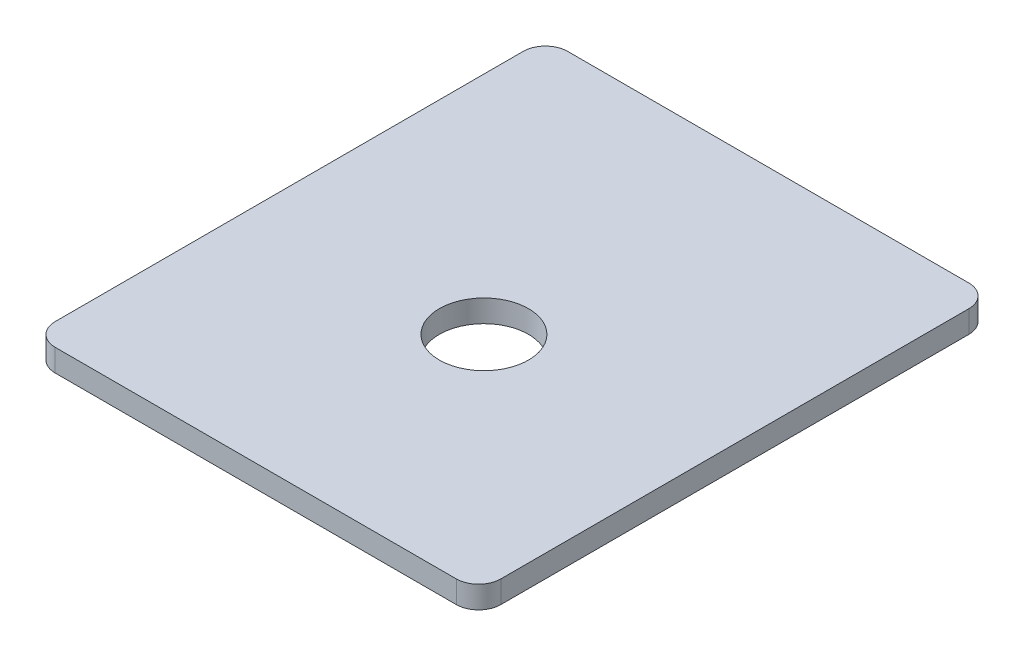
ISO-10303-21;
HEADER;
FILE_DESCRIPTION(('STEP AP214'),'2;1');
FILE_NAME('part.step','',(''),(''),'','','');
FILE_SCHEMA(('AUTOMOTIVE_DESIGN { 1 0 10303 214 1 1 1 1 }'));
ENDSEC;
DATA;
#1=APPLICATION_CONTEXT('core data for automotive mechanical design processes');
#2=APPLICATION_PROTOCOL_DEFINITION('international standard','automotive_design',2000,#1);
#3=PRODUCT_CONTEXT('',#1,'mechanical');
#4=PRODUCT('Part','Part','',(#3));
#5=PRODUCT_RELATED_PRODUCT_CATEGORY('part','',(#4));
#6=PRODUCT_DEFINITION_FORMATION('','',#4);
#7=PRODUCT_DEFINITION_CONTEXT('part definition',#1,'design');
#8=PRODUCT_DEFINITION('design','',#6,#7);
#9=PRODUCT_DEFINITION_SHAPE('','',#8);
#10=(LENGTH_UNIT() NAMED_UNIT(*) SI_UNIT(.MILLI.,.METRE.));
#11=(NAMED_UNIT(*) PLANE_ANGLE_UNIT() SI_UNIT($,.RADIAN.));
#12=(NAMED_UNIT(*) SI_UNIT($,.STERADIAN.) SOLID_ANGLE_UNIT());
#13=UNCERTAINTY_MEASURE_WITH_UNIT(LENGTH_MEASURE(1.E-05),#10,'distance_accuracy_value','');
#14=(GEOMETRIC_REPRESENTATION_CONTEXT(3) GLOBAL_UNCERTAINTY_ASSIGNED_CONTEXT((#13)) GLOBAL_UNIT_ASSIGNED_CONTEXT((#10,
#11,#12)) REPRESENTATION_CONTEXT('',''));
#15=CARTESIAN_POINT('',(0.,0.,0.));
#16=DIRECTION('',(0.,0.,1.));
#17=DIRECTION('',(1.,0.,0.));
#18=AXIS2_PLACEMENT_3D('',#15,#16,#17);
#19=CARTESIAN_POINT('',(-20.,2.,21.));
#20=DIRECTION('',(1.,0.,0.));
#21=DIRECTION('',(0.,0.,-1.));
#22=AXIS2_PLACEMENT_3D('',#19,#20,#21);
#23=PLANE('',#22);
#24=DIRECTION('',(0.,0.,-1.));
#25=VECTOR('',#24,1.);
#26=CARTESIAN_POINT('',(-20.,0.,21.));
#27=LINE('',#26,#25);
#28=CARTESIAN_POINT('',(-20.,0.,-19.));
#29=VERTEX_POINT('',#28);
#30=CARTESIAN_POINT('',(-20.,0.,23.));
#31=VERTEX_POINT('',#30);
#32=EDGE_CURVE('E116',#29,#31,#27,.F.);
#33=ORIENTED_EDGE('',*,*,#32,.T.);
#34=DIRECTION('',(0.,-1.,0.));
#35=VECTOR('',#34,1.);
#36=CARTESIAN_POINT('',(-20.,2.,23.));
#37=LINE('',#36,#35);
#38=CARTESIAN_POINT('',(-20.,2.,23.));
#39=VERTEX_POINT('',#38);
#40=EDGE_CURVE('E168',#31,#39,#37,.F.);
#41=ORIENTED_EDGE('',*,*,#40,.T.);
#42=DIRECTION('',(0.,0.,1.));
#43=VECTOR('',#42,1.);
#44=CARTESIAN_POINT('',(-20.,2.,21.));
#45=LINE('',#44,#43);
#46=CARTESIAN_POINT('',(-20.,2.,-19.));
#47=VERTEX_POINT('',#46);
#48=EDGE_CURVE('E140',#47,#39,#45,.T.);
#49=ORIENTED_EDGE('',*,*,#48,.F.);
#50=DIRECTION('',(0.,-1.,0.));
#51=VECTOR('',#50,1.);
#52=CARTESIAN_POINT('',(-20.,2.,-19.));
#53=LINE('',#52,#51);
#54=EDGE_CURVE('E149',#47,#29,#53,.T.);
#55=ORIENTED_EDGE('',*,*,#54,.T.);
#56=EDGE_LOOP('',(#33,#41,#49,#55));
#57=FACE_BOUND('',#56,.T.);
#58=ADVANCED_FACE('F43',(#57),#23,.F.);
#59=CARTESIAN_POINT('',(18.,2.,-19.));
#60=DIRECTION('',(0.,1.,0.));
#61=DIRECTION('',(0.,0.,1.));
#62=AXIS2_PLACEMENT_3D('',#59,#60,#61);
#63=PLANE('',#62);
#64=DIRECTION('',(-1.,0.,0.));
#65=VECTOR('',#64,1.);
#66=CARTESIAN_POINT('',(20.,2.,25.));
#67=LINE('',#66,#65);
#68=CARTESIAN_POINT('',(18.,2.,25.));
#69=VERTEX_POINT('',#68);
#70=CARTESIAN_POINT('',(-18.,2.,25.));
#71=VERTEX_POINT('',#70);
#72=EDGE_CURVE('E155',#69,#71,#67,.T.);
#73=ORIENTED_EDGE('',*,*,#72,.F.);
#74=CARTESIAN_POINT('',(18.,2.,23.));
#75=DIRECTION('',(0.,1.,0.));
#76=DIRECTION('',(0.,0.,1.));
#77=AXIS2_PLACEMENT_3D('',#74,#75,#76);
#78=CIRCLE('',#77,2.);
#79=CARTESIAN_POINT('',(20.,2.,23.));
#80=VERTEX_POINT('',#79);
#81=EDGE_CURVE('E11',#69,#80,#78,.T.);
#82=ORIENTED_EDGE('',*,*,#81,.T.);
#83=DIRECTION('',(0.,0.,-1.));
#84=VECTOR('',#83,1.);
#85=CARTESIAN_POINT('',(20.,2.,27.));
#86=LINE('',#85,#84);
#87=CARTESIAN_POINT('',(20.,2.,-19.));
#88=VERTEX_POINT('',#87);
#89=EDGE_CURVE('E102',#80,#88,#86,.T.);
#90=ORIENTED_EDGE('',*,*,#89,.T.);
#91=CARTESIAN_POINT('',(18.,2.,-19.));
#92=DIRECTION('',(0.,1.,0.));
#93=DIRECTION('',(0.,0.,1.));
#94=AXIS2_PLACEMENT_3D('',#91,#92,#93);
#95=CIRCLE('',#94,2.);
#96=CARTESIAN_POINT('',(18.,2.,-21.));
#97=VERTEX_POINT('',#96);
#98=EDGE_CURVE('E109',#88,#97,#95,.T.);
#99=ORIENTED_EDGE('',*,*,#98,.T.);
#100=DIRECTION('',(-1.,0.,0.));
#101=VECTOR('',#100,1.);
#102=CARTESIAN_POINT('',(18.,2.,-21.));
#103=LINE('',#102,#101);
#104=CARTESIAN_POINT('',(-18.,2.,-21.));
#105=VERTEX_POINT('',#104);
#106=EDGE_CURVE('E128',#97,#105,#103,.T.);
#107=ORIENTED_EDGE('',*,*,#106,.T.);
#108=CARTESIAN_POINT('',(-18.,2.,-19.));
#109=DIRECTION('',(0.,1.,0.));
#110=DIRECTION('',(0.,0.,1.));
#111=AXIS2_PLACEMENT_3D('',#108,#109,#110);
#112=CIRCLE('',#111,2.);
#113=EDGE_CURVE('E135',#105,#47,#112,.T.);
#114=ORIENTED_EDGE('',*,*,#113,.T.);
#115=ORIENTED_EDGE('',*,*,#48,.T.);
#116=CARTESIAN_POINT('',(-18.,2.,23.));
#117=DIRECTION('',(0.,1.,0.));
#118=DIRECTION('',(0.,0.,1.));
#119=AXIS2_PLACEMENT_3D('',#116,#117,#118);
#120=CIRCLE('',#119,2.);
#121=EDGE_CURVE('E166',#39,#71,#120,.T.);
#122=ORIENTED_EDGE('',*,*,#121,.T.);
#123=EDGE_LOOP('',(#73,#82,#90,#99,#107,#114,#115,#122));
#124=FACE_BOUND('',#123,.T.);
#125=CARTESIAN_POINT('',(0.232716016147772,2.,4.75187196741028));
#126=DIRECTION('',(0.,1.,0.));
#127=DIRECTION('',(0.,0.,1.));
#128=AXIS2_PLACEMENT_3D('',#125,#126,#127);
#129=CIRCLE('',#128,4.);
#130=CARTESIAN_POINT('',(0.232716016147772,2.,8.75187196741028));
#131=VERTEX_POINT('',#130);
#132=EDGE_CURVE('E139',#131,#131,#129,.T.);
#133=ORIENTED_EDGE('',*,*,#132,.F.);
#134=EDGE_LOOP('',(#133));
#135=FACE_BOUND('',#134,.T.);
#136=ADVANCED_FACE('F110',(#124,#135),#63,.T.);
#137=CARTESIAN_POINT('',(18.,0.,-19.));
#138=DIRECTION('',(0.,1.,0.));
#139=DIRECTION('',(0.,0.,1.));
#140=AXIS2_PLACEMENT_3D('',#137,#138,#139);
#141=PLANE('',#140);
#142=DIRECTION('',(0.,0.,-1.));
#143=VECTOR('',#142,1.);
#144=CARTESIAN_POINT('',(20.,0.,21.));
#145=LINE('',#144,#143);
#146=CARTESIAN_POINT('',(20.,0.,23.));
#147=VERTEX_POINT('',#146);
#148=CARTESIAN_POINT('',(20.,0.,-19.));
#149=VERTEX_POINT('',#148);
#150=EDGE_CURVE('E122',#147,#149,#145,.T.);
#151=ORIENTED_EDGE('',*,*,#150,.F.);
#152=CARTESIAN_POINT('',(18.,0.,23.));
#153=DIRECTION('',(0.,1.,0.));
#154=DIRECTION('',(0.,0.,1.));
#155=AXIS2_PLACEMENT_3D('',#152,#153,#154);
#156=CIRCLE('',#155,2.);
#157=CARTESIAN_POINT('',(18.,0.,25.));
#158=VERTEX_POINT('',#157);
#159=EDGE_CURVE('E63',#147,#158,#156,.F.);
#160=ORIENTED_EDGE('',*,*,#159,.T.);
#161=DIRECTION('',(-1.,0.,0.));
#162=VECTOR('',#161,1.);
#163=CARTESIAN_POINT('',(32.,0.,25.));
#164=LINE('',#163,#162);
#165=CARTESIAN_POINT('',(-18.,0.,25.));
#166=VERTEX_POINT('',#165);
#167=EDGE_CURVE('E153',#158,#166,#164,.T.);
#168=ORIENTED_EDGE('',*,*,#167,.T.);
#169=CARTESIAN_POINT('',(-18.,0.,23.));
#170=DIRECTION('',(0.,1.,0.));
#171=DIRECTION('',(0.,0.,1.));
#172=AXIS2_PLACEMENT_3D('',#169,#170,#171);
#173=CIRCLE('',#172,2.);
#174=EDGE_CURVE('E165',#166,#31,#173,.F.);
#175=ORIENTED_EDGE('',*,*,#174,.T.);
#176=ORIENTED_EDGE('',*,*,#32,.F.);
#177=CARTESIAN_POINT('',(-18.,0.,-19.));
#178=DIRECTION('',(0.,1.,0.));
#179=DIRECTION('',(0.,0.,1.));
#180=AXIS2_PLACEMENT_3D('',#177,#178,#179);
#181=CIRCLE('',#180,2.);
#182=CARTESIAN_POINT('',(-18.,0.,-21.));
#183=VERTEX_POINT('',#182);
#184=EDGE_CURVE('E144',#183,#29,#181,.T.);
#185=ORIENTED_EDGE('',*,*,#184,.F.);
#186=DIRECTION('',(-1.,0.,0.));
#187=VECTOR('',#186,1.);
#188=CARTESIAN_POINT('',(18.,0.,-21.));
#189=LINE('',#188,#187);
#190=CARTESIAN_POINT('',(18.,0.,-21.));
#191=VERTEX_POINT('',#190);
#192=EDGE_CURVE('E145',#191,#183,#189,.T.);
#193=ORIENTED_EDGE('',*,*,#192,.F.);
#194=CARTESIAN_POINT('',(18.,0.,-19.));
#195=DIRECTION('',(0.,1.,0.));
#196=DIRECTION('',(0.,0.,1.));
#197=AXIS2_PLACEMENT_3D('',#194,#195,#196);
#198=CIRCLE('',#197,2.);
#199=EDGE_CURVE('E137',#149,#191,#198,.T.);
#200=ORIENTED_EDGE('',*,*,#199,.F.);
#201=EDGE_LOOP('',(#151,#160,#168,#175,#176,#185,#193,#200));
#202=FACE_BOUND('',#201,.T.);
#203=CARTESIAN_POINT('',(0.232716016147772,0.,4.75187196741028));
#204=DIRECTION('',(0.,1.,0.));
#205=DIRECTION('',(0.,0.,1.));
#206=AXIS2_PLACEMENT_3D('',#203,#204,#205);
#207=CIRCLE('',#206,4.);
#208=CARTESIAN_POINT('',(0.232716016147772,0.,8.75187196741028));
#209=VERTEX_POINT('',#208);
#210=EDGE_CURVE('E151',#209,#209,#207,.T.);
#211=ORIENTED_EDGE('',*,*,#210,.T.);
#212=EDGE_LOOP('',(#211));
#213=FACE_BOUND('',#212,.T.);
#214=ADVANCED_FACE('F172',(#202,#213),#141,.F.);
#215=CARTESIAN_POINT('',(20.,2.,21.));
#216=DIRECTION('',(-1.,0.,0.));
#217=DIRECTION('',(0.,0.,1.));
#218=AXIS2_PLACEMENT_3D('',#215,#216,#217);
#219=PLANE('',#218);
#220=ORIENTED_EDGE('',*,*,#89,.F.);
#221=DIRECTION('',(0.,-1.,0.));
#222=VECTOR('',#221,1.);
#223=CARTESIAN_POINT('',(20.,2.,23.));
#224=LINE('',#223,#222);
#225=EDGE_CURVE('E171',#80,#147,#224,.T.);
#226=ORIENTED_EDGE('',*,*,#225,.T.);
#227=ORIENTED_EDGE('',*,*,#150,.T.);
#228=DIRECTION('',(0.,-1.,0.));
#229=VECTOR('',#228,1.);
#230=CARTESIAN_POINT('',(20.,2.,-19.));
#231=LINE('',#230,#229);
#232=EDGE_CURVE('E118',#88,#149,#231,.T.);
#233=ORIENTED_EDGE('',*,*,#232,.F.);
#234=EDGE_LOOP('',(#220,#226,#227,#233));
#235=FACE_BOUND('',#234,.T.);
#236=ADVANCED_FACE('F119',(#235),#219,.F.);
#237=CARTESIAN_POINT('',(18.,2.,-19.));
#238=DIRECTION('',(0.,-1.,0.));
#239=DIRECTION('',(0.,0.,-1.));
#240=AXIS2_PLACEMENT_3D('',#237,#238,#239);
#241=CYLINDRICAL_SURFACE('',#240,2.);
#242=ORIENTED_EDGE('',*,*,#199,.T.);
#243=DIRECTION('',(0.,-1.,0.));
#244=VECTOR('',#243,1.);
#245=CARTESIAN_POINT('',(18.,2.,-21.));
#246=LINE('',#245,#244);
#247=EDGE_CURVE('E123',#97,#191,#246,.T.);
#248=ORIENTED_EDGE('',*,*,#247,.F.);
#249=ORIENTED_EDGE('',*,*,#98,.F.);
#250=ORIENTED_EDGE('',*,*,#232,.T.);
#251=EDGE_LOOP('',(#242,#248,#249,#250));
#252=FACE_BOUND('',#251,.T.);
#253=ADVANCED_FACE('F130',(#252),#241,.T.);
#254=CARTESIAN_POINT('',(18.,2.,-21.));
#255=DIRECTION('',(0.,0.,1.));
#256=DIRECTION('',(1.,0.,0.));
#257=AXIS2_PLACEMENT_3D('',#254,#255,#256);
#258=PLANE('',#257);
#259=ORIENTED_EDGE('',*,*,#192,.T.);
#260=DIRECTION('',(0.,-1.,0.));
#261=VECTOR('',#260,1.);
#262=CARTESIAN_POINT('',(-18.,2.,-21.));
#263=LINE('',#262,#261);
#264=EDGE_CURVE('E143',#105,#183,#263,.T.);
#265=ORIENTED_EDGE('',*,*,#264,.F.);
#266=ORIENTED_EDGE('',*,*,#106,.F.);
#267=ORIENTED_EDGE('',*,*,#247,.T.);
#268=EDGE_LOOP('',(#259,#265,#266,#267));
#269=FACE_BOUND('',#268,.T.);
#270=ADVANCED_FACE('F177',(#269),#258,.F.);
#271=CARTESIAN_POINT('',(-18.,2.,-19.));
#272=DIRECTION('',(0.,-1.,0.));
#273=DIRECTION('',(0.,0.,-1.));
#274=AXIS2_PLACEMENT_3D('',#271,#272,#273);
#275=CYLINDRICAL_SURFACE('',#274,2.);
#276=ORIENTED_EDGE('',*,*,#184,.T.);
#277=ORIENTED_EDGE('',*,*,#54,.F.);
#278=ORIENTED_EDGE('',*,*,#113,.F.);
#279=ORIENTED_EDGE('',*,*,#264,.T.);
#280=EDGE_LOOP('',(#276,#277,#278,#279));
#281=FACE_BOUND('',#280,.T.);
#282=ADVANCED_FACE('F187',(#281),#275,.T.);
#283=CARTESIAN_POINT('',(0.232716016147772,2.,4.75187196741028));
#284=DIRECTION('',(0.,-1.,0.));
#285=DIRECTION('',(0.,0.,-1.));
#286=AXIS2_PLACEMENT_3D('',#283,#284,#285);
#287=CYLINDRICAL_SURFACE('',#286,4.);
#288=ORIENTED_EDGE('',*,*,#132,.T.);
#289=EDGE_LOOP('',(#288));
#290=FACE_BOUND('',#289,.T.);
#291=ORIENTED_EDGE('',*,*,#210,.F.);
#292=EDGE_LOOP('',(#291));
#293=FACE_BOUND('',#292,.T.);
#294=ADVANCED_FACE('F209',(#290,#293),#287,.F.);
#295=CARTESIAN_POINT('',(32.,42.,25.));
#296=DIRECTION('',(0.,0.,-1.));
#297=DIRECTION('',(-1.,0.,0.));
#298=AXIS2_PLACEMENT_3D('',#295,#296,#297);
#299=PLANE('',#298);
#300=ORIENTED_EDGE('',*,*,#167,.F.);
#301=DIRECTION('',(0.,-1.,0.));
#302=VECTOR('',#301,1.);
#303=CARTESIAN_POINT('',(18.,42.,25.));
#304=LINE('',#303,#302);
#305=EDGE_CURVE('E51',#158,#69,#304,.F.);
#306=ORIENTED_EDGE('',*,*,#305,.T.);
#307=ORIENTED_EDGE('',*,*,#72,.T.);
#308=DIRECTION('',(0.,-1.,0.));
#309=VECTOR('',#308,1.);
#310=CARTESIAN_POINT('',(-18.,42.,25.));
#311=LINE('',#310,#309);
#312=EDGE_CURVE('E121',#71,#166,#311,.T.);
#313=ORIENTED_EDGE('',*,*,#312,.T.);
#314=EDGE_LOOP('',(#300,#306,#307,#313));
#315=FACE_BOUND('',#314,.T.);
#316=ADVANCED_FACE('F199',(#315),#299,.F.);
#317=CARTESIAN_POINT('',(-18.,42.,23.));
#318=DIRECTION('',(0.,-1.,0.));
#319=DIRECTION('',(0.,0.,-1.));
#320=AXIS2_PLACEMENT_3D('',#317,#318,#319);
#321=CYLINDRICAL_SURFACE('',#320,2.);
#322=ORIENTED_EDGE('',*,*,#121,.F.);
#323=ORIENTED_EDGE('',*,*,#40,.F.);
#324=ORIENTED_EDGE('',*,*,#174,.F.);
#325=ORIENTED_EDGE('',*,*,#312,.F.);
#326=EDGE_LOOP('',(#322,#323,#324,#325));
#327=FACE_BOUND('',#326,.T.);
#328=ADVANCED_FACE('F192',(#327),#321,.T.);
#329=CARTESIAN_POINT('',(18.,2.,23.));
#330=DIRECTION('',(0.,-1.,0.));
#331=DIRECTION('',(0.,0.,-1.));
#332=AXIS2_PLACEMENT_3D('',#329,#330,#331);
#333=CYLINDRICAL_SURFACE('',#332,2.);
#334=ORIENTED_EDGE('',*,*,#81,.F.);
#335=ORIENTED_EDGE('',*,*,#305,.F.);
#336=ORIENTED_EDGE('',*,*,#159,.F.);
#337=ORIENTED_EDGE('',*,*,#225,.F.);
#338=EDGE_LOOP('',(#334,#335,#336,#337));
#339=FACE_BOUND('',#338,.T.);
#340=ADVANCED_FACE('F44',(#339),#333,.T.);
#341=CLOSED_SHELL('',(#58,#136,#214,#236,#253,#270,#282,#294,#316,#328,#340));
#342=MANIFOLD_SOLID_BREP('B2',#341);
#343=ADVANCED_BREP_SHAPE_REPRESENTATION('',(#18,#342),#14);
#344=SHAPE_DEFINITION_REPRESENTATION(#9,#343);
ENDSEC;
END-ISO-10303-21;
